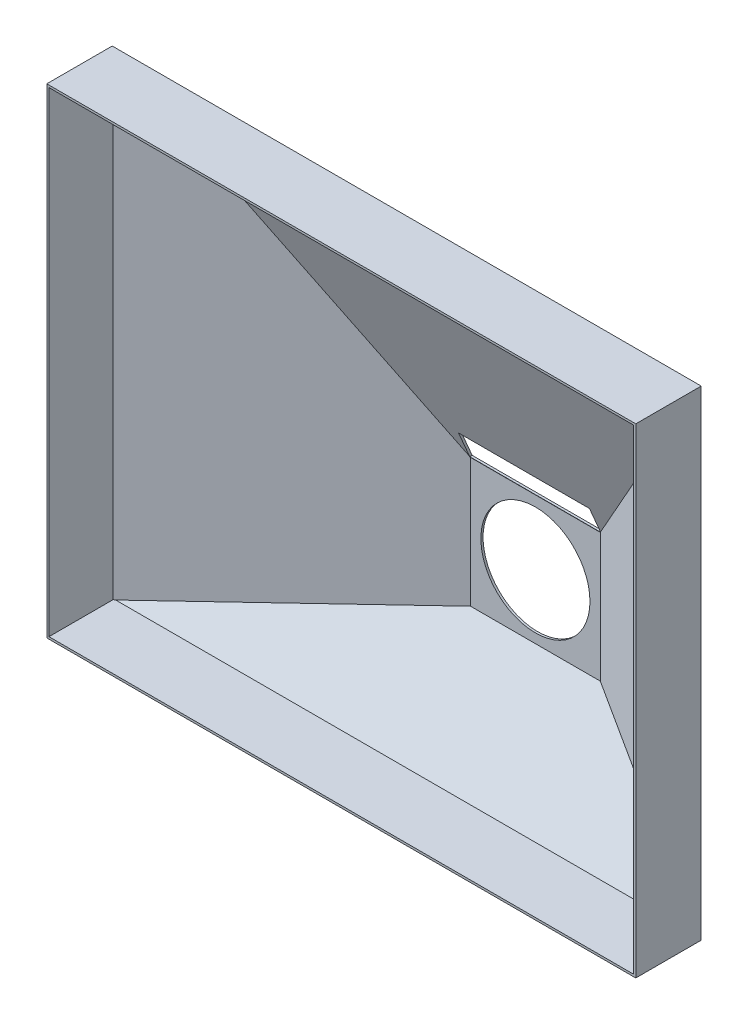
ISO-10303-21;
HEADER;
FILE_DESCRIPTION(('STEP AP214'),'2;1');
FILE_NAME('part.step','',(''),(''),'','','');
FILE_SCHEMA(('AUTOMOTIVE_DESIGN { 1 0 10303 214 1 1 1 1 }'));
ENDSEC;
DATA;
#1=APPLICATION_CONTEXT('core data for automotive mechanical design processes');
#2=APPLICATION_PROTOCOL_DEFINITION('international standard','automotive_design',2000,#1);
#3=PRODUCT_CONTEXT('',#1,'mechanical');
#4=PRODUCT('Part','Part','',(#3));
#5=PRODUCT_RELATED_PRODUCT_CATEGORY('part','',(#4));
#6=PRODUCT_DEFINITION_FORMATION('','',#4);
#7=PRODUCT_DEFINITION_CONTEXT('part definition',#1,'design');
#8=PRODUCT_DEFINITION('design','',#6,#7);
#9=PRODUCT_DEFINITION_SHAPE('','',#8);
#10=(LENGTH_UNIT() NAMED_UNIT(*) SI_UNIT(.MILLI.,.METRE.));
#11=(NAMED_UNIT(*) PLANE_ANGLE_UNIT() SI_UNIT($,.RADIAN.));
#12=(NAMED_UNIT(*) SI_UNIT($,.STERADIAN.) SOLID_ANGLE_UNIT());
#13=UNCERTAINTY_MEASURE_WITH_UNIT(LENGTH_MEASURE(1.E-05),#10,'distance_accuracy_value','');
#14=(GEOMETRIC_REPRESENTATION_CONTEXT(3) GLOBAL_UNCERTAINTY_ASSIGNED_CONTEXT((#13)) GLOBAL_UNIT_ASSIGNED_CONTEXT((#10,
#11,#12)) REPRESENTATION_CONTEXT('',''));
#15=CARTESIAN_POINT('',(0.,0.,0.));
#16=DIRECTION('',(0.,0.,1.));
#17=DIRECTION('',(1.,0.,0.));
#18=AXIS2_PLACEMENT_3D('',#15,#16,#17);
#19=CARTESIAN_POINT('',(0.,4.26125311521393,-9.94292393549918));
#20=DIRECTION('',(0.,-0.393919298579168,0.919145030018058));
#21=DIRECTION('',(0.,-0.919145030018058,-0.393919298579168));
#22=AXIS2_PLACEMENT_3D('',#19,#20,#21);
#23=PLANE('',#22);
#24=DIRECTION('',(0.,0.919145030018058,0.393919298579168));
#25=VECTOR('',#24,1.);
#26=CARTESIAN_POINT('',(30.,4.26125311521393,-9.94292393549918));
#27=LINE('',#26,#25);
#28=CARTESIAN_POINT('',(30.,30.1488282141449,1.15175110689978));
#29=VERTEX_POINT('',#28);
#30=CARTESIAN_POINT('',(30.,42.,6.23082472940912));
#31=VERTEX_POINT('',#30);
#32=EDGE_CURVE('E12',#29,#31,#27,.T.);
#33=ORIENTED_EDGE('',*,*,#32,.F.);
#34=DIRECTION('',(-0.567567567567568,-0.756756756756757,-0.324324324324324));
#35=VECTOR('',#34,1.);
#36=CARTESIAN_POINT('',(7.17476094312934,-0.284823861682673,-11.8912426398834));
#37=LINE('',#36,#35);
#38=CARTESIAN_POINT('',(134.,168.815494880847,60.5803225354862));
#39=VERTEX_POINT('',#38);
#40=EDGE_CURVE('E301',#39,#29,#37,.T.);
#41=ORIENTED_EDGE('',*,*,#40,.F.);
#42=DIRECTION('',(0.,0.919145030018058,0.393919298579168));
#43=VECTOR('',#42,1.);
#44=CARTESIAN_POINT('',(134.,4.26125311521395,-9.94292393549918));
#45=LINE('',#44,#43);
#46=CARTESIAN_POINT('',(134.,169.,60.6593961579805));
#47=VERTEX_POINT('',#46);
#48=EDGE_CURVE('E348',#39,#47,#45,.T.);
#49=ORIENTED_EDGE('',*,*,#48,.T.);
#50=DIRECTION('',(-1.,0.,0.));
#51=VECTOR('',#50,1.);
#52=CARTESIAN_POINT('',(0.,169.,60.6593961579805));
#53=LINE('',#52,#51);
#54=CARTESIAN_POINT('',(-134.,169.,60.6593961579165));
#55=VERTEX_POINT('',#54);
#56=EDGE_CURVE('E313',#47,#55,#53,.T.);
#57=ORIENTED_EDGE('',*,*,#56,.T.);
#58=DIRECTION('',(0.,0.919145030018058,0.393919298579168));
#59=VECTOR('',#58,1.);
#60=CARTESIAN_POINT('',(-133.999999999977,-180886.60081585,-77534.5980963493));
#61=LINE('',#60,#59);
#62=CARTESIAN_POINT('',(-134.,168.815494880812,60.5803225354712));
#63=VERTEX_POINT('',#62);
#64=EDGE_CURVE('E351',#63,#55,#61,.T.);
#65=ORIENTED_EDGE('',*,*,#64,.F.);
#66=DIRECTION('',(0.567567567567568,-0.756756756756757,-0.324324324324324));
#67=VECTOR('',#66,1.);
#68=CARTESIAN_POINT('',(-7.17476094312935,-0.284823861682678,-11.8912426398834));
#69=LINE('',#68,#67);
#70=CARTESIAN_POINT('',(-30.,30.1488282141449,1.15175110689978));
#71=VERTEX_POINT('',#70);
#72=EDGE_CURVE('E328',#63,#71,#69,.T.);
#73=ORIENTED_EDGE('',*,*,#72,.T.);
#74=DIRECTION('',(0.,-0.919145030018058,-0.393919298579168));
#75=VECTOR('',#74,1.);
#76=CARTESIAN_POINT('',(-30.,4.26125311521393,-9.94292393549918));
#77=LINE('',#76,#75);
#78=CARTESIAN_POINT('',(-30.,42.,6.23082472940913));
#79=VERTEX_POINT('',#78);
#80=EDGE_CURVE('E276',#79,#71,#77,.T.);
#81=ORIENTED_EDGE('',*,*,#80,.F.);
#82=DIRECTION('',(-1.,0.,0.));
#83=VECTOR('',#82,1.);
#84=CARTESIAN_POINT('',(0.,42.,6.23082472940912));
#85=LINE('',#84,#83);
#86=EDGE_CURVE('E56',#31,#79,#85,.T.);
#87=ORIENTED_EDGE('',*,*,#86,.F.);
#88=EDGE_LOOP('',(#33,#41,#49,#57,#65,#73,#81,#87));
#89=FACE_BOUND('',#88,.T.);
#90=ADVANCED_FACE('F45',(#89),#23,.T.);
#91=CARTESIAN_POINT('',(0.,0.,0.));
#92=DIRECTION('',(0.,0.,1.));
#93=DIRECTION('',(1.,0.,0.));
#94=AXIS2_PLACEMENT_3D('',#91,#92,#93);
#95=PLANE('',#94);
#96=CARTESIAN_POINT('',(0.,0.,0.));
#97=DIRECTION('',(0.,0.,1.));
#98=DIRECTION('',(1.,0.,0.));
#99=AXIS2_PLACEMENT_3D('',#96,#97,#98);
#100=CIRCLE('',#99,25.);
#101=CARTESIAN_POINT('',(25.,0.,0.));
#102=VERTEX_POINT('',#101);
#103=EDGE_CURVE('E293',#102,#102,#100,.T.);
#104=ORIENTED_EDGE('',*,*,#103,.T.);
#105=EDGE_LOOP('',(#104));
#106=FACE_BOUND('',#105,.T.);
#107=DIRECTION('',(0.,1.,0.));
#108=VECTOR('',#107,1.);
#109=CARTESIAN_POINT('',(30.,30.,0.));
#110=LINE('',#109,#108);
#111=CARTESIAN_POINT('',(30.,-30.,0.));
#112=VERTEX_POINT('',#111);
#113=CARTESIAN_POINT('',(30.,30.,0.));
#114=VERTEX_POINT('',#113);
#115=EDGE_CURVE('E243',#112,#114,#110,.T.);
#116=ORIENTED_EDGE('',*,*,#115,.F.);
#117=DIRECTION('',(1.,0.,0.));
#118=VECTOR('',#117,1.);
#119=CARTESIAN_POINT('',(-30.,-30.,0.));
#120=LINE('',#119,#118);
#121=CARTESIAN_POINT('',(-30.,-30.,0.));
#122=VERTEX_POINT('',#121);
#123=EDGE_CURVE('E226',#122,#112,#120,.T.);
#124=ORIENTED_EDGE('',*,*,#123,.F.);
#125=DIRECTION('',(0.,-1.,0.));
#126=VECTOR('',#125,1.);
#127=CARTESIAN_POINT('',(-30.,30.,0.));
#128=LINE('',#127,#126);
#129=CARTESIAN_POINT('',(-30.,30.,0.));
#130=VERTEX_POINT('',#129);
#131=EDGE_CURVE('E50',#130,#122,#128,.T.);
#132=ORIENTED_EDGE('',*,*,#131,.F.);
#133=DIRECTION('',(-1.,0.,0.));
#134=VECTOR('',#133,1.);
#135=CARTESIAN_POINT('',(-30.,30.,0.));
#136=LINE('',#135,#134);
#137=EDGE_CURVE('E191',#114,#130,#136,.T.);
#138=ORIENTED_EDGE('',*,*,#137,.F.);
#139=EDGE_LOOP('',(#116,#124,#132,#138));
#140=FACE_BOUND('',#139,.T.);
#141=ADVANCED_FACE('F47',(#106,#140),#95,.F.);
#142=CARTESIAN_POINT('',(0.,-27.,-8.99999999999999));
#143=DIRECTION('',(0.,0.948683298050514,0.316227766016837));
#144=DIRECTION('',(0.,-0.316227766016837,0.948683298050514));
#145=AXIS2_PLACEMENT_3D('',#142,#143,#144);
#146=PLANE('',#145);
#147=DIRECTION('',(0.856607867270404,0.163163403289601,-0.489490209868803));
#148=VECTOR('',#147,1.);
#149=CARTESIAN_POINT('',(-135.,-50.,60.));
#150=LINE('',#149,#148);
#151=CARTESIAN_POINT('',(-135.,-50.,60.));
#152=VERTEX_POINT('',#151);
#153=EDGE_CURVE('E712',#152,#122,#150,.T.);
#154=ORIENTED_EDGE('',*,*,#153,.T.);
#155=ORIENTED_EDGE('',*,*,#123,.T.);
#156=DIRECTION('',(-0.856607867270404,0.1631634032896,-0.489490209868802));
#157=VECTOR('',#156,1.);
#158=CARTESIAN_POINT('',(135.,-50.,60.));
#159=LINE('',#158,#157);
#160=CARTESIAN_POINT('',(135.,-50.,60.0000000000023));
#161=VERTEX_POINT('',#160);
#162=EDGE_CURVE('E222',#161,#112,#159,.T.);
#163=ORIENTED_EDGE('',*,*,#162,.F.);
#164=DIRECTION('',(1.,0.,0.));
#165=VECTOR('',#164,1.);
#166=CARTESIAN_POINT('',(-135.,-50.,60.));
#167=LINE('',#166,#165);
#168=EDGE_CURVE('E250',#152,#161,#167,.T.);
#169=ORIENTED_EDGE('',*,*,#168,.F.);
#170=EDGE_LOOP('',(#154,#155,#163,#169));
#171=FACE_BOUND('',#170,.T.);
#172=ADVANCED_FACE('F390',(#171),#146,.F.);
#173=CARTESIAN_POINT('',(7.38461538461538,0.,-12.9230769230769));
#174=DIRECTION('',(0.496138938356834,0.,-0.868243142124459));
#175=DIRECTION('',(-0.868243142124459,0.,-0.496138938356834));
#176=AXIS2_PLACEMENT_3D('',#173,#174,#175);
#177=PLANE('',#176);
#178=ORIENTED_EDGE('',*,*,#162,.T.);
#179=ORIENTED_EDGE('',*,*,#115,.T.);
#180=DIRECTION('',(-0.567567567567568,-0.756756756756757,-0.324324324324324));
#181=VECTOR('',#180,1.);
#182=CARTESIAN_POINT('',(135.,170.,60.));
#183=LINE('',#182,#181);
#184=CARTESIAN_POINT('',(135.,170.,60.));
#185=VERTEX_POINT('',#184);
#186=EDGE_CURVE('E221',#185,#114,#183,.T.);
#187=ORIENTED_EDGE('',*,*,#186,.F.);
#188=DIRECTION('',(0.,1.,0.));
#189=VECTOR('',#188,1.);
#190=CARTESIAN_POINT('',(135.,170.,60.));
#191=LINE('',#190,#189);
#192=EDGE_CURVE('E259',#161,#185,#191,.T.);
#193=ORIENTED_EDGE('',*,*,#192,.F.);
#194=EDGE_LOOP('',(#178,#179,#187,#193));
#195=FACE_BOUND('',#194,.T.);
#196=ADVANCED_FACE('F434',(#195),#177,.T.);
#197=CARTESIAN_POINT('',(-7.38461538461539,0.,-12.9230769230769));
#198=DIRECTION('',(0.496138938356834,0.,0.868243142124459));
#199=DIRECTION('',(0.868243142124459,0.,-0.496138938356834));
#200=AXIS2_PLACEMENT_3D('',#197,#198,#199);
#201=PLANE('',#200);
#202=DIRECTION('',(0.567567567567568,-0.756756756756757,-0.324324324324324));
#203=VECTOR('',#202,1.);
#204=CARTESIAN_POINT('',(-135.,170.,60.));
#205=LINE('',#204,#203);
#206=CARTESIAN_POINT('',(-135.,170.,60.));
#207=VERTEX_POINT('',#206);
#208=EDGE_CURVE('E208',#207,#130,#205,.T.);
#209=ORIENTED_EDGE('',*,*,#208,.T.);
#210=ORIENTED_EDGE('',*,*,#131,.T.);
#211=ORIENTED_EDGE('',*,*,#153,.F.);
#212=DIRECTION('',(0.,-1.,0.));
#213=VECTOR('',#212,1.);
#214=CARTESIAN_POINT('',(-135.,170.,60.));
#215=LINE('',#214,#213);
#216=EDGE_CURVE('E219',#207,#152,#215,.T.);
#217=ORIENTED_EDGE('',*,*,#216,.F.);
#218=EDGE_LOOP('',(#209,#210,#211,#217));
#219=FACE_BOUND('',#218,.T.);
#220=ADVANCED_FACE('F214',(#219),#201,.F.);
#221=CARTESIAN_POINT('',(0.,4.6551724137931,-10.8620689655172));
#222=DIRECTION('',(0.,-0.393919298579168,0.919145030018058));
#223=DIRECTION('',(0.,-0.919145030018058,-0.393919298579168));
#224=AXIS2_PLACEMENT_3D('',#221,#222,#223);
#225=PLANE('',#224);
#226=ORIENTED_EDGE('',*,*,#186,.T.);
#227=DIRECTION('',(0.,0.919145030018058,0.393919298579168));
#228=VECTOR('',#227,1.);
#229=CARTESIAN_POINT('',(30.,4.6551724137931,-10.8620689655172));
#230=LINE('',#229,#228);
#231=CARTESIAN_POINT('',(30.,42.,5.14285714285714));
#232=VERTEX_POINT('',#231);
#233=EDGE_CURVE('E282',#114,#232,#230,.T.);
#234=ORIENTED_EDGE('',*,*,#233,.T.);
#235=DIRECTION('',(-1.,0.,0.));
#236=VECTOR('',#235,1.);
#237=CARTESIAN_POINT('',(0.,42.,5.14285714285714));
#238=LINE('',#237,#236);
#239=CARTESIAN_POINT('',(-30.,42.,5.14285714285714));
#240=VERTEX_POINT('',#239);
#241=EDGE_CURVE('E211',#232,#240,#238,.T.);
#242=ORIENTED_EDGE('',*,*,#241,.T.);
#243=DIRECTION('',(0.,-0.919145030018058,-0.393919298579168));
#244=VECTOR('',#243,1.);
#245=CARTESIAN_POINT('',(-30.,4.6551724137931,-10.8620689655172));
#246=LINE('',#245,#244);
#247=EDGE_CURVE('E183',#240,#130,#246,.T.);
#248=ORIENTED_EDGE('',*,*,#247,.T.);
#249=ORIENTED_EDGE('',*,*,#208,.F.);
#250=DIRECTION('',(-1.,0.,0.));
#251=VECTOR('',#250,1.);
#252=CARTESIAN_POINT('',(-135.,170.,60.));
#253=LINE('',#252,#251);
#254=EDGE_CURVE('E274',#185,#207,#253,.T.);
#255=ORIENTED_EDGE('',*,*,#254,.F.);
#256=EDGE_LOOP('',(#226,#234,#242,#248,#249,#255));
#257=FACE_BOUND('',#256,.T.);
#258=ADVANCED_FACE('F206',(#257),#225,.F.);
#259=CARTESIAN_POINT('',(-135.,-50.,-500000.));
#260=DIRECTION('',(0.,-1.,0.));
#261=DIRECTION('',(0.,0.,-1.));
#262=AXIS2_PLACEMENT_3D('',#259,#260,#261);
#263=PLANE('',#262);
#264=ORIENTED_EDGE('',*,*,#168,.T.);
#265=DIRECTION('',(0.,0.,1.));
#266=VECTOR('',#265,1.);
#267=CARTESIAN_POINT('',(135.,-50.,-500000.));
#268=LINE('',#267,#266);
#269=CARTESIAN_POINT('',(135.,-50.,90.));
#270=VERTEX_POINT('',#269);
#271=EDGE_CURVE('E354',#161,#270,#268,.T.);
#272=ORIENTED_EDGE('',*,*,#271,.T.);
#273=DIRECTION('',(1.,0.,0.));
#274=VECTOR('',#273,1.);
#275=CARTESIAN_POINT('',(-135.,-50.,90.));
#276=LINE('',#275,#274);
#277=CARTESIAN_POINT('',(-135.,-50.,90.));
#278=VERTEX_POINT('',#277);
#279=EDGE_CURVE('E273',#278,#270,#276,.T.);
#280=ORIENTED_EDGE('',*,*,#279,.F.);
#281=DIRECTION('',(0.,0.,1.));
#282=VECTOR('',#281,1.);
#283=CARTESIAN_POINT('',(-135.,-50.,-500000.));
#284=LINE('',#283,#282);
#285=EDGE_CURVE('E409',#152,#278,#284,.T.);
#286=ORIENTED_EDGE('',*,*,#285,.F.);
#287=EDGE_LOOP('',(#264,#272,#280,#286));
#288=FACE_BOUND('',#287,.T.);
#289=ADVANCED_FACE('F368',(#288),#263,.T.);
#290=CARTESIAN_POINT('',(135.,-50.,-500000.));
#291=DIRECTION('',(1.,0.,0.));
#292=DIRECTION('',(0.,1.,0.));
#293=AXIS2_PLACEMENT_3D('',#290,#291,#292);
#294=PLANE('',#293);
#295=ORIENTED_EDGE('',*,*,#192,.T.);
#296=DIRECTION('',(0.,0.,1.));
#297=VECTOR('',#296,1.);
#298=CARTESIAN_POINT('',(135.,170.,-500000.));
#299=LINE('',#298,#297);
#300=CARTESIAN_POINT('',(135.,170.,90.));
#301=VERTEX_POINT('',#300);
#302=EDGE_CURVE('E398',#185,#301,#299,.T.);
#303=ORIENTED_EDGE('',*,*,#302,.T.);
#304=DIRECTION('',(0.,1.,0.));
#305=VECTOR('',#304,1.);
#306=CARTESIAN_POINT('',(135.,-50.,90.));
#307=LINE('',#306,#305);
#308=EDGE_CURVE('E746',#270,#301,#307,.T.);
#309=ORIENTED_EDGE('',*,*,#308,.F.);
#310=ORIENTED_EDGE('',*,*,#271,.F.);
#311=EDGE_LOOP('',(#295,#303,#309,#310));
#312=FACE_BOUND('',#311,.T.);
#313=ADVANCED_FACE('F378',(#312),#294,.T.);
#314=CARTESIAN_POINT('',(135.,170.,-500000.));
#315=DIRECTION('',(0.,1.,0.));
#316=DIRECTION('',(0.,0.,1.));
#317=AXIS2_PLACEMENT_3D('',#314,#315,#316);
#318=PLANE('',#317);
#319=ORIENTED_EDGE('',*,*,#254,.T.);
#320=DIRECTION('',(0.,0.,1.));
#321=VECTOR('',#320,1.);
#322=CARTESIAN_POINT('',(-135.,170.,-500000.));
#323=LINE('',#322,#321);
#324=CARTESIAN_POINT('',(-135.,170.,90.));
#325=VERTEX_POINT('',#324);
#326=EDGE_CURVE('E413',#207,#325,#323,.T.);
#327=ORIENTED_EDGE('',*,*,#326,.T.);
#328=DIRECTION('',(-1.,0.,0.));
#329=VECTOR('',#328,1.);
#330=CARTESIAN_POINT('',(135.,170.,90.));
#331=LINE('',#330,#329);
#332=EDGE_CURVE('E757',#301,#325,#331,.T.);
#333=ORIENTED_EDGE('',*,*,#332,.F.);
#334=ORIENTED_EDGE('',*,*,#302,.F.);
#335=EDGE_LOOP('',(#319,#327,#333,#334));
#336=FACE_BOUND('',#335,.T.);
#337=ADVANCED_FACE('F381',(#336),#318,.T.);
#338=CARTESIAN_POINT('',(-135.,170.,-500000.));
#339=DIRECTION('',(-1.,0.,0.));
#340=DIRECTION('',(0.,-1.,0.));
#341=AXIS2_PLACEMENT_3D('',#338,#339,#340);
#342=PLANE('',#341);
#343=ORIENTED_EDGE('',*,*,#216,.T.);
#344=ORIENTED_EDGE('',*,*,#285,.T.);
#345=DIRECTION('',(0.,-1.,0.));
#346=VECTOR('',#345,1.);
#347=CARTESIAN_POINT('',(-135.,170.,90.));
#348=LINE('',#347,#346);
#349=EDGE_CURVE('E412',#325,#278,#348,.T.);
#350=ORIENTED_EDGE('',*,*,#349,.F.);
#351=ORIENTED_EDGE('',*,*,#326,.F.);
#352=EDGE_LOOP('',(#343,#344,#350,#351));
#353=FACE_BOUND('',#352,.T.);
#354=ADVANCED_FACE('F384',(#353),#342,.T.);
#355=CARTESIAN_POINT('',(0.,0.,90.));
#356=DIRECTION('',(0.,0.,1.));
#357=DIRECTION('',(1.,0.,0.));
#358=AXIS2_PLACEMENT_3D('',#355,#356,#357);
#359=PLANE('',#358);
#360=DIRECTION('',(1.,0.,0.));
#361=VECTOR('',#360,1.);
#362=CARTESIAN_POINT('',(0.,-49.,90.));
#363=LINE('',#362,#361);
#364=CARTESIAN_POINT('',(-134.,-49.,90.));
#365=VERTEX_POINT('',#364);
#366=CARTESIAN_POINT('',(134.,-49.,90.));
#367=VERTEX_POINT('',#366);
#368=EDGE_CURVE('E327',#365,#367,#363,.T.);
#369=ORIENTED_EDGE('',*,*,#368,.F.);
#370=DIRECTION('',(0.,-1.,0.));
#371=VECTOR('',#370,1.);
#372=CARTESIAN_POINT('',(-134.,0.,90.));
#373=LINE('',#372,#371);
#374=CARTESIAN_POINT('',(-134.,169.,90.));
#375=VERTEX_POINT('',#374);
#376=EDGE_CURVE('E339',#375,#365,#373,.T.);
#377=ORIENTED_EDGE('',*,*,#376,.F.);
#378=DIRECTION('',(-1.,0.,0.));
#379=VECTOR('',#378,1.);
#380=CARTESIAN_POINT('',(0.,169.,90.));
#381=LINE('',#380,#379);
#382=CARTESIAN_POINT('',(134.,169.,90.));
#383=VERTEX_POINT('',#382);
#384=EDGE_CURVE('E72',#383,#375,#381,.T.);
#385=ORIENTED_EDGE('',*,*,#384,.F.);
#386=DIRECTION('',(0.,1.,0.));
#387=VECTOR('',#386,1.);
#388=CARTESIAN_POINT('',(134.,0.,90.));
#389=LINE('',#388,#387);
#390=EDGE_CURVE('E357',#367,#383,#389,.T.);
#391=ORIENTED_EDGE('',*,*,#390,.F.);
#392=EDGE_LOOP('',(#369,#377,#385,#391));
#393=FACE_BOUND('',#392,.T.);
#394=ORIENTED_EDGE('',*,*,#279,.T.);
#395=ORIENTED_EDGE('',*,*,#308,.T.);
#396=ORIENTED_EDGE('',*,*,#332,.T.);
#397=ORIENTED_EDGE('',*,*,#349,.T.);
#398=EDGE_LOOP('',(#394,#395,#396,#397));
#399=FACE_BOUND('',#398,.T.);
#400=ADVANCED_FACE('F388',(#393,#399),#359,.T.);
#401=CARTESIAN_POINT('',(0.,0.,1.));
#402=DIRECTION('',(0.,0.,1.));
#403=DIRECTION('',(1.,0.,0.));
#404=AXIS2_PLACEMENT_3D('',#401,#402,#403);
#405=PLANE('',#404);
#406=CARTESIAN_POINT('',(0.,0.,1.));
#407=DIRECTION('',(0.,0.,1.));
#408=DIRECTION('',(1.,0.,0.));
#409=AXIS2_PLACEMENT_3D('',#406,#407,#408);
#410=CIRCLE('',#409,25.);
#411=CARTESIAN_POINT('',(25.,0.,1.));
#412=VERTEX_POINT('',#411);
#413=EDGE_CURVE('E284',#412,#412,#410,.T.);
#414=ORIENTED_EDGE('',*,*,#413,.F.);
#415=EDGE_LOOP('',(#414));
#416=FACE_BOUND('',#415,.T.);
#417=DIRECTION('',(0.,1.,0.));
#418=VECTOR('',#417,1.);
#419=CARTESIAN_POINT('',(29.7344355629254,0.,1.));
#420=LINE('',#419,#418);
#421=CARTESIAN_POINT('',(29.7344355629254,-29.2792407799439,1.));
#422=VERTEX_POINT('',#421);
#423=CARTESIAN_POINT('',(29.7344355629254,29.7947422980454,1.));
#424=VERTEX_POINT('',#423);
#425=EDGE_CURVE('E297',#422,#424,#420,.T.);
#426=ORIENTED_EDGE('',*,*,#425,.T.);
#427=DIRECTION('',(-1.,0.,0.));
#428=VECTOR('',#427,1.);
#429=CARTESIAN_POINT('',(0.,29.7947422980454,1.));
#430=LINE('',#429,#428);
#431=CARTESIAN_POINT('',(-29.7344355629254,29.7947422980454,1.));
#432=VERTEX_POINT('',#431);
#433=EDGE_CURVE('E305',#424,#432,#430,.T.);
#434=ORIENTED_EDGE('',*,*,#433,.T.);
#435=DIRECTION('',(0.,-1.,0.));
#436=VECTOR('',#435,1.);
#437=CARTESIAN_POINT('',(-29.7344355629254,0.,1.));
#438=LINE('',#437,#436);
#439=CARTESIAN_POINT('',(-29.7344355629254,-29.2792407799439,1.));
#440=VERTEX_POINT('',#439);
#441=EDGE_CURVE('E303',#432,#440,#438,.T.);
#442=ORIENTED_EDGE('',*,*,#441,.T.);
#443=DIRECTION('',(1.,0.,0.));
#444=VECTOR('',#443,1.);
#445=CARTESIAN_POINT('',(0.,-29.2792407799439,0.999999999999999));
#446=LINE('',#445,#444);
#447=EDGE_CURVE('E300',#440,#422,#446,.T.);
#448=ORIENTED_EDGE('',*,*,#447,.T.);
#449=EDGE_LOOP('',(#426,#434,#442,#448));
#450=FACE_BOUND('',#449,.T.);
#451=ADVANCED_FACE('F380',(#416,#450),#405,.T.);
#452=CARTESIAN_POINT('',(0.,-26.0513167019495,-8.68377223398315));
#453=DIRECTION('',(0.,0.948683298050514,0.316227766016837));
#454=DIRECTION('',(0.,-0.316227766016837,0.948683298050514));
#455=AXIS2_PLACEMENT_3D('',#452,#453,#454);
#456=PLANE('',#455);
#457=DIRECTION('',(0.856607867270404,0.163163403289601,-0.489490209868803));
#458=VECTOR('',#457,1.);
#459=CARTESIAN_POINT('',(-3.40441508245054,-24.263998783663,-14.0457259888428));
#460=LINE('',#459,#458);
#461=CARTESIAN_POINT('',(-133.26842146822,-49.,60.1622776601684));
#462=VERTEX_POINT('',#461);
#463=EDGE_CURVE('E309',#462,#440,#460,.T.);
#464=ORIENTED_EDGE('',*,*,#463,.F.);
#465=DIRECTION('',(1.,0.,0.));
#466=VECTOR('',#465,1.);
#467=CARTESIAN_POINT('',(0.,-49.,60.1622776601684));
#468=LINE('',#467,#466);
#469=CARTESIAN_POINT('',(133.26842146822,-49.,60.1622776601684));
#470=VERTEX_POINT('',#469);
#471=EDGE_CURVE('E317',#462,#470,#468,.T.);
#472=ORIENTED_EDGE('',*,*,#471,.T.);
#473=DIRECTION('',(-0.856607867270404,0.1631634032896,-0.489490209868802));
#474=VECTOR('',#473,1.);
#475=CARTESIAN_POINT('',(3.40441508245054,-24.263998783663,-14.0457259888428));
#476=LINE('',#475,#474);
#477=EDGE_CURVE('E312',#470,#422,#476,.T.);
#478=ORIENTED_EDGE('',*,*,#477,.T.);
#479=ORIENTED_EDGE('',*,*,#447,.F.);
#480=EDGE_LOOP('',(#464,#472,#478,#479));
#481=FACE_BOUND('',#480,.T.);
#482=ADVANCED_FACE('F508',(#481),#456,.T.);
#483=CARTESIAN_POINT('',(6.88847644625855,0.,-12.0548337809525));
#484=DIRECTION('',(0.496138938356834,0.,-0.868243142124459));
#485=DIRECTION('',(-0.868243142124459,0.,-0.496138938356834));
#486=AXIS2_PLACEMENT_3D('',#483,#484,#485);
#487=PLANE('',#486);
#488=ORIENTED_EDGE('',*,*,#40,.T.);
#489=DIRECTION('',(0.,-1.,0.));
#490=VECTOR('',#489,1.);
#491=CARTESIAN_POINT('',(30.,0.,1.15175110689979));
#492=LINE('',#491,#490);
#493=CARTESIAN_POINT('',(30.,30.,1.15175110689978));
#494=VERTEX_POINT('',#493);
#495=EDGE_CURVE('E285',#29,#494,#492,.T.);
#496=ORIENTED_EDGE('',*,*,#495,.T.);
#497=DIRECTION('',(-0.868243142124459,0.,-0.496138938356834));
#498=VECTOR('',#497,1.);
#499=CARTESIAN_POINT('',(6.88847644625855,30.,-12.0548337809525));
#500=LINE('',#499,#498);
#501=CARTESIAN_POINT('',(29.8883788393914,30.,1.08796758655198));
#502=VERTEX_POINT('',#501);
#503=EDGE_CURVE('E479',#494,#502,#500,.T.);
#504=ORIENTED_EDGE('',*,*,#503,.T.);
#505=EDGE_CURVE('E324',#502,#424,#37,.T.);
#506=ORIENTED_EDGE('',*,*,#505,.T.);
#507=ORIENTED_EDGE('',*,*,#425,.F.);
#508=ORIENTED_EDGE('',*,*,#477,.F.);
#509=DIRECTION('',(0.868243142124459,0.,0.496138938356834));
#510=VECTOR('',#509,1.);
#511=CARTESIAN_POINT('',(-215479.496138938,-49.,-123147.131756858));
#512=LINE('',#511,#510);
#513=CARTESIAN_POINT('',(134.,-49.,60.5803225354862));
#514=VERTEX_POINT('',#513);
#515=EDGE_CURVE('E308',#470,#514,#512,.T.);
#516=ORIENTED_EDGE('',*,*,#515,.T.);
#517=DIRECTION('',(0.,1.,0.));
#518=VECTOR('',#517,1.);
#519=CARTESIAN_POINT('',(134.,-49.999999999997,60.5803225354862));
#520=LINE('',#519,#518);
#521=EDGE_CURVE('E321',#514,#39,#520,.T.);
#522=ORIENTED_EDGE('',*,*,#521,.T.);
#523=EDGE_LOOP('',(#488,#496,#504,#506,#507,#508,#516,#522));
#524=FACE_BOUND('',#523,.T.);
#525=ADVANCED_FACE('F487',(#524),#487,.F.);
#526=CARTESIAN_POINT('',(-6.88847644625856,0.,-12.0548337809525));
#527=DIRECTION('',(0.496138938356834,0.,0.868243142124459));
#528=DIRECTION('',(0.868243142124459,0.,-0.496138938356834));
#529=AXIS2_PLACEMENT_3D('',#526,#527,#528);
#530=PLANE('',#529);
#531=DIRECTION('',(0.,-1.,0.));
#532=VECTOR('',#531,1.);
#533=CARTESIAN_POINT('',(-30.,0.,1.15175110689978));
#534=LINE('',#533,#532);
#535=CARTESIAN_POINT('',(-30.,30.,1.15175110689978));
#536=VERTEX_POINT('',#535);
#537=EDGE_CURVE('E186',#71,#536,#534,.T.);
#538=ORIENTED_EDGE('',*,*,#537,.F.);
#539=ORIENTED_EDGE('',*,*,#72,.F.);
#540=DIRECTION('',(0.,-1.,0.));
#541=VECTOR('',#540,1.);
#542=CARTESIAN_POINT('',(-134.,0.,60.5803225354712));
#543=LINE('',#542,#541);
#544=CARTESIAN_POINT('',(-134.,-49.,60.5803225354862));
#545=VERTEX_POINT('',#544);
#546=EDGE_CURVE('E320',#63,#545,#543,.T.);
#547=ORIENTED_EDGE('',*,*,#546,.T.);
#548=DIRECTION('',(-0.868243142124459,0.,0.496138938356834));
#549=VECTOR('',#548,1.);
#550=CARTESIAN_POINT('',(215275.9576774,-49.,-123030.82406455));
#551=LINE('',#550,#549);
#552=EDGE_CURVE('E345',#462,#545,#551,.T.);
#553=ORIENTED_EDGE('',*,*,#552,.F.);
#554=ORIENTED_EDGE('',*,*,#463,.T.);
#555=ORIENTED_EDGE('',*,*,#441,.F.);
#556=CARTESIAN_POINT('',(-29.8883788393914,30.,1.08796758655198));
#557=VERTEX_POINT('',#556);
#558=EDGE_CURVE('E316',#557,#432,#69,.T.);
#559=ORIENTED_EDGE('',*,*,#558,.F.);
#560=DIRECTION('',(0.868243142124459,0.,-0.496138938356834));
#561=VECTOR('',#560,1.);
#562=CARTESIAN_POINT('',(-6.88847644625856,30.,-12.0548337809525));
#563=LINE('',#562,#561);
#564=EDGE_CURVE('E64',#536,#557,#563,.T.);
#565=ORIENTED_EDGE('',*,*,#564,.F.);
#566=EDGE_LOOP('',(#538,#539,#547,#553,#554,#555,#559,#565));
#567=FACE_BOUND('',#566,.T.);
#568=ADVANCED_FACE('F495',(#567),#530,.T.);
#569=DIRECTION('',(1.,0.,0.));
#570=VECTOR('',#569,1.);
#571=CARTESIAN_POINT('',(0.,30.,1.08796758655198));
#572=LINE('',#571,#570);
#573=EDGE_CURVE('E199',#557,#502,#572,.T.);
#574=ORIENTED_EDGE('',*,*,#573,.F.);
#575=ORIENTED_EDGE('',*,*,#558,.T.);
#576=ORIENTED_EDGE('',*,*,#433,.F.);
#577=ORIENTED_EDGE('',*,*,#505,.F.);
#578=EDGE_LOOP('',(#574,#575,#576,#577));
#579=FACE_BOUND('',#578,.T.);
#580=ADVANCED_FACE('F514',(#579),#23,.T.);
#581=CARTESIAN_POINT('',(-135.,-49.,-500000.));
#582=DIRECTION('',(0.,-1.,0.));
#583=DIRECTION('',(0.,0.,-1.));
#584=AXIS2_PLACEMENT_3D('',#581,#582,#583);
#585=PLANE('',#584);
#586=ORIENTED_EDGE('',*,*,#471,.F.);
#587=ORIENTED_EDGE('',*,*,#552,.T.);
#588=DIRECTION('',(0.,0.,1.));
#589=VECTOR('',#588,1.);
#590=CARTESIAN_POINT('',(-134.,-49.,-500000.));
#591=LINE('',#590,#589);
#592=EDGE_CURVE('E337',#545,#365,#591,.T.);
#593=ORIENTED_EDGE('',*,*,#592,.T.);
#594=ORIENTED_EDGE('',*,*,#368,.T.);
#595=DIRECTION('',(0.,0.,1.));
#596=VECTOR('',#595,1.);
#597=CARTESIAN_POINT('',(134.,-49.,-500000.));
#598=LINE('',#597,#596);
#599=EDGE_CURVE('E296',#514,#367,#598,.T.);
#600=ORIENTED_EDGE('',*,*,#599,.F.);
#601=ORIENTED_EDGE('',*,*,#515,.F.);
#602=EDGE_LOOP('',(#586,#587,#593,#594,#600,#601));
#603=FACE_BOUND('',#602,.T.);
#604=ADVANCED_FACE('F502',(#603),#585,.F.);
#605=CARTESIAN_POINT('',(134.,-50.,-500000.));
#606=DIRECTION('',(1.,0.,0.));
#607=DIRECTION('',(0.,1.,0.));
#608=AXIS2_PLACEMENT_3D('',#605,#606,#607);
#609=PLANE('',#608);
#610=ORIENTED_EDGE('',*,*,#521,.F.);
#611=ORIENTED_EDGE('',*,*,#599,.T.);
#612=ORIENTED_EDGE('',*,*,#390,.T.);
#613=DIRECTION('',(0.,0.,1.));
#614=VECTOR('',#613,1.);
#615=CARTESIAN_POINT('',(134.,169.,-500000.));
#616=LINE('',#615,#614);
#617=EDGE_CURVE('E336',#47,#383,#616,.T.);
#618=ORIENTED_EDGE('',*,*,#617,.F.);
#619=ORIENTED_EDGE('',*,*,#48,.F.);
#620=EDGE_LOOP('',(#610,#611,#612,#618,#619));
#621=FACE_BOUND('',#620,.T.);
#622=ADVANCED_FACE('F516',(#621),#609,.F.);
#623=CARTESIAN_POINT('',(135.,169.,-500000.));
#624=DIRECTION('',(0.,1.,0.));
#625=DIRECTION('',(0.,0.,1.));
#626=AXIS2_PLACEMENT_3D('',#623,#624,#625);
#627=PLANE('',#626);
#628=ORIENTED_EDGE('',*,*,#56,.F.);
#629=ORIENTED_EDGE('',*,*,#617,.T.);
#630=ORIENTED_EDGE('',*,*,#384,.T.);
#631=DIRECTION('',(0.,0.,1.));
#632=VECTOR('',#631,1.);
#633=CARTESIAN_POINT('',(-134.,169.,-500000.));
#634=LINE('',#633,#632);
#635=EDGE_CURVE('E340',#55,#375,#634,.T.);
#636=ORIENTED_EDGE('',*,*,#635,.F.);
#637=EDGE_LOOP('',(#628,#629,#630,#636));
#638=FACE_BOUND('',#637,.T.);
#639=ADVANCED_FACE('F523',(#638),#627,.F.);
#640=CARTESIAN_POINT('',(-134.,170.,-500000.));
#641=DIRECTION('',(-1.,0.,0.));
#642=DIRECTION('',(0.,-1.,0.));
#643=AXIS2_PLACEMENT_3D('',#640,#641,#642);
#644=PLANE('',#643);
#645=ORIENTED_EDGE('',*,*,#546,.F.);
#646=ORIENTED_EDGE('',*,*,#64,.T.);
#647=ORIENTED_EDGE('',*,*,#635,.T.);
#648=ORIENTED_EDGE('',*,*,#376,.T.);
#649=ORIENTED_EDGE('',*,*,#592,.F.);
#650=EDGE_LOOP('',(#645,#646,#647,#648,#649));
#651=FACE_BOUND('',#650,.T.);
#652=ADVANCED_FACE('F499',(#651),#644,.F.);
#653=CARTESIAN_POINT('',(0.,0.,-9.));
#654=DIRECTION('',(0.,0.,1.));
#655=DIRECTION('',(1.,0.,0.));
#656=AXIS2_PLACEMENT_3D('',#653,#654,#655);
#657=CYLINDRICAL_SURFACE('',#656,25.);
#658=ORIENTED_EDGE('',*,*,#413,.T.);
#659=EDGE_LOOP('',(#658));
#660=FACE_BOUND('',#659,.T.);
#661=ORIENTED_EDGE('',*,*,#103,.F.);
#662=EDGE_LOOP('',(#661));
#663=FACE_BOUND('',#662,.T.);
#664=ADVANCED_FACE('F530',(#660,#663),#657,.F.);
#665=CARTESIAN_POINT('',(30.,30.,10.));
#666=DIRECTION('',(1.,0.,0.));
#667=DIRECTION('',(0.,0.,-1.));
#668=AXIS2_PLACEMENT_3D('',#665,#666,#667);
#669=PLANE('',#668);
#670=DIRECTION('',(0.,0.,-1.));
#671=VECTOR('',#670,1.);
#672=CARTESIAN_POINT('',(30.,30.,10.));
#673=LINE('',#672,#671);
#674=EDGE_CURVE('E188',#494,#114,#673,.T.);
#675=ORIENTED_EDGE('',*,*,#674,.F.);
#676=ORIENTED_EDGE('',*,*,#495,.F.);
#677=ORIENTED_EDGE('',*,*,#32,.T.);
#678=DIRECTION('',(0.,0.,-1.));
#679=VECTOR('',#678,1.);
#680=CARTESIAN_POINT('',(30.,42.,10.));
#681=LINE('',#680,#679);
#682=EDGE_CURVE('E474',#31,#232,#681,.T.);
#683=ORIENTED_EDGE('',*,*,#682,.T.);
#684=ORIENTED_EDGE('',*,*,#233,.F.);
#685=EDGE_LOOP('',(#675,#676,#677,#683,#684));
#686=FACE_BOUND('',#685,.T.);
#687=ADVANCED_FACE('F471',(#686),#669,.F.);
#688=CARTESIAN_POINT('',(30.,42.,10.));
#689=DIRECTION('',(0.,1.,0.));
#690=DIRECTION('',(0.,0.,1.));
#691=AXIS2_PLACEMENT_3D('',#688,#689,#690);
#692=PLANE('',#691);
#693=ORIENTED_EDGE('',*,*,#682,.F.);
#694=ORIENTED_EDGE('',*,*,#86,.T.);
#695=DIRECTION('',(0.,0.,-1.));
#696=VECTOR('',#695,1.);
#697=CARTESIAN_POINT('',(-30.,42.,10.));
#698=LINE('',#697,#696);
#699=EDGE_CURVE('E187',#79,#240,#698,.T.);
#700=ORIENTED_EDGE('',*,*,#699,.T.);
#701=ORIENTED_EDGE('',*,*,#241,.F.);
#702=EDGE_LOOP('',(#693,#694,#700,#701));
#703=FACE_BOUND('',#702,.T.);
#704=ADVANCED_FACE('F492',(#703),#692,.F.);
#705=CARTESIAN_POINT('',(-30.,30.,10.));
#706=DIRECTION('',(-1.,0.,0.));
#707=DIRECTION('',(0.,0.,1.));
#708=AXIS2_PLACEMENT_3D('',#705,#706,#707);
#709=PLANE('',#708);
#710=ORIENTED_EDGE('',*,*,#699,.F.);
#711=ORIENTED_EDGE('',*,*,#80,.T.);
#712=ORIENTED_EDGE('',*,*,#537,.T.);
#713=DIRECTION('',(0.,0.,-1.));
#714=VECTOR('',#713,1.);
#715=CARTESIAN_POINT('',(-30.,30.,10.));
#716=LINE('',#715,#714);
#717=EDGE_CURVE('E178',#536,#130,#716,.T.);
#718=ORIENTED_EDGE('',*,*,#717,.T.);
#719=ORIENTED_EDGE('',*,*,#247,.F.);
#720=EDGE_LOOP('',(#710,#711,#712,#718,#719));
#721=FACE_BOUND('',#720,.T.);
#722=ADVANCED_FACE('F181',(#721),#709,.F.);
#723=CARTESIAN_POINT('',(30.,30.,10.));
#724=DIRECTION('',(0.,-1.,0.));
#725=DIRECTION('',(0.,0.,-1.));
#726=AXIS2_PLACEMENT_3D('',#723,#724,#725);
#727=PLANE('',#726);
#728=ORIENTED_EDGE('',*,*,#674,.T.);
#729=ORIENTED_EDGE('',*,*,#137,.T.);
#730=ORIENTED_EDGE('',*,*,#717,.F.);
#731=ORIENTED_EDGE('',*,*,#564,.T.);
#732=ORIENTED_EDGE('',*,*,#573,.T.);
#733=ORIENTED_EDGE('',*,*,#503,.F.);
#734=EDGE_LOOP('',(#728,#729,#730,#731,#732,#733));
#735=FACE_BOUND('',#734,.T.);
#736=ADVANCED_FACE('F192',(#735),#727,.F.);
#737=CLOSED_SHELL('',(#90,#141,#172,#196,#220,#258,#289,#313,#337,#354,#400,#451,#482,#525,#568,
#580,#604,#622,#639,#652,#664,#687,#704,#722,#736));
#738=MANIFOLD_SOLID_BREP('B2',#737);
#739=ADVANCED_BREP_SHAPE_REPRESENTATION('',(#18,#738),#14);
#740=SHAPE_DEFINITION_REPRESENTATION(#9,#739);
ENDSEC;
END-ISO-10303-21;
